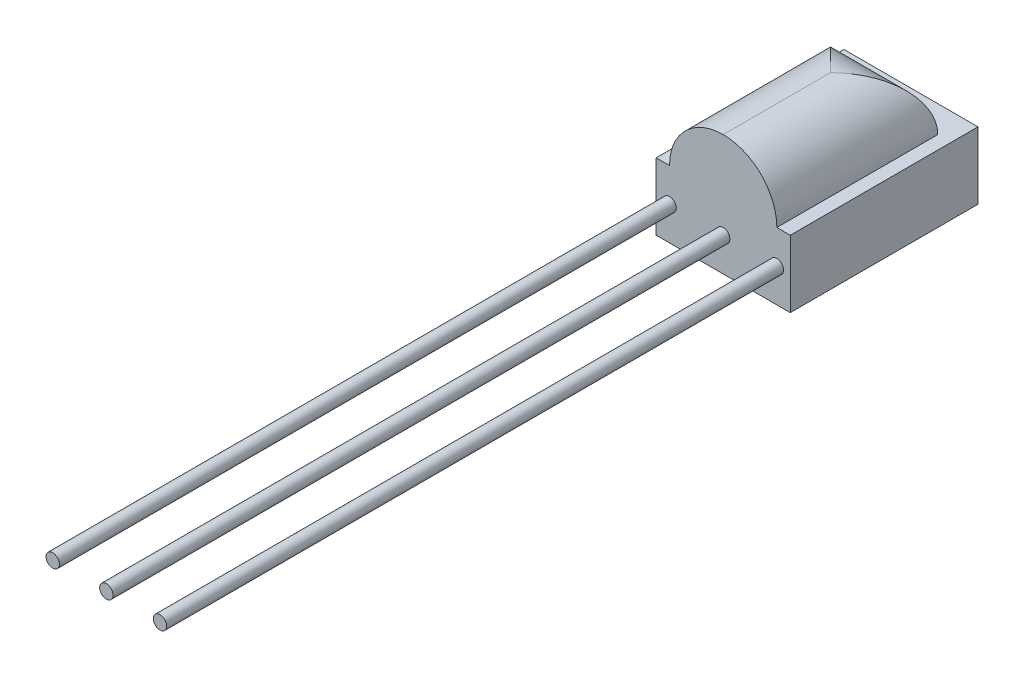
ISO-10303-21;
HEADER;
FILE_DESCRIPTION(('STEP AP214'),'2;1');
FILE_NAME('part.step','',(''),(''),'','','');
FILE_SCHEMA(('AUTOMOTIVE_DESIGN { 1 0 10303 214 1 1 1 1 }'));
ENDSEC;
DATA;
#1=APPLICATION_CONTEXT('core data for automotive mechanical design processes');
#2=APPLICATION_PROTOCOL_DEFINITION('international standard','automotive_design',2000,#1);
#3=PRODUCT_CONTEXT('',#1,'mechanical');
#4=PRODUCT('Part','Part','',(#3));
#5=PRODUCT_RELATED_PRODUCT_CATEGORY('part','',(#4));
#6=PRODUCT_DEFINITION_FORMATION('','',#4);
#7=PRODUCT_DEFINITION_CONTEXT('part definition',#1,'design');
#8=PRODUCT_DEFINITION('design','',#6,#7);
#9=PRODUCT_DEFINITION_SHAPE('','',#8);
#10=(LENGTH_UNIT() NAMED_UNIT(*) SI_UNIT(.MILLI.,.METRE.));
#11=(NAMED_UNIT(*) PLANE_ANGLE_UNIT() SI_UNIT($,.RADIAN.));
#12=(NAMED_UNIT(*) SI_UNIT($,.STERADIAN.) SOLID_ANGLE_UNIT());
#13=UNCERTAINTY_MEASURE_WITH_UNIT(LENGTH_MEASURE(1.E-05),#10,'distance_accuracy_value','');
#14=(GEOMETRIC_REPRESENTATION_CONTEXT(3) GLOBAL_UNCERTAINTY_ASSIGNED_CONTEXT((#13)) GLOBAL_UNIT_ASSIGNED_CONTEXT((#10,
#11,#12)) REPRESENTATION_CONTEXT('',''));
#15=CARTESIAN_POINT('',(0.,0.,0.));
#16=DIRECTION('',(0.,0.,1.));
#17=DIRECTION('',(1.,0.,0.));
#18=AXIS2_PLACEMENT_3D('',#15,#16,#17);
#19=CARTESIAN_POINT('',(0.,2.5,0.));
#20=DIRECTION('',(0.,-1.,0.));
#21=DIRECTION('',(0.,0.,-1.));
#22=AXIS2_PLACEMENT_3D('',#19,#20,#21);
#23=PLANE('',#22);
#24=DIRECTION('',(0.,0.,1.));
#25=VECTOR('',#24,1.);
#26=CARTESIAN_POINT('',(0.5,2.5,-6.));
#27=LINE('',#26,#25);
#28=CARTESIAN_POINT('',(0.5,2.5,-6.));
#29=VERTEX_POINT('',#28);
#30=CARTESIAN_POINT('',(0.500000000000001,2.5,0.));
#31=VERTEX_POINT('',#30);
#32=EDGE_CURVE('E99',#29,#31,#27,.T.);
#33=ORIENTED_EDGE('',*,*,#32,.F.);
#34=DIRECTION('',(-1.,0.,0.));
#35=VECTOR('',#34,1.);
#36=CARTESIAN_POINT('',(0.5,2.5,-6.));
#37=LINE('',#36,#35);
#38=CARTESIAN_POINT('',(4.5,2.5,-6.));
#39=VERTEX_POINT('',#38);
#40=EDGE_CURVE('E87',#39,#29,#37,.T.);
#41=ORIENTED_EDGE('',*,*,#40,.F.);
#42=DIRECTION('',(0.,0.,-1.));
#43=VECTOR('',#42,1.);
#44=CARTESIAN_POINT('',(4.5,2.5,-6.));
#45=LINE('',#44,#43);
#46=CARTESIAN_POINT('',(4.5,2.5,0.));
#47=VERTEX_POINT('',#46);
#48=EDGE_CURVE('E104',#47,#39,#45,.T.);
#49=ORIENTED_EDGE('',*,*,#48,.F.);
#50=DIRECTION('',(1.,0.,0.));
#51=VECTOR('',#50,1.);
#52=CARTESIAN_POINT('',(0.,2.5,0.));
#53=LINE('',#52,#51);
#54=CARTESIAN_POINT('',(5.,2.5,0.));
#55=VERTEX_POINT('',#54);
#56=EDGE_CURVE('E133',#47,#55,#53,.T.);
#57=ORIENTED_EDGE('',*,*,#56,.T.);
#58=DIRECTION('',(0.,0.,-1.));
#59=VECTOR('',#58,1.);
#60=CARTESIAN_POINT('',(5.,2.5,0.));
#61=LINE('',#60,#59);
#62=CARTESIAN_POINT('',(5.,2.5,-7.));
#63=VERTEX_POINT('',#62);
#64=EDGE_CURVE('E137',#55,#63,#61,.T.);
#65=ORIENTED_EDGE('',*,*,#64,.T.);
#66=DIRECTION('',(-1.,0.,0.));
#67=VECTOR('',#66,1.);
#68=CARTESIAN_POINT('',(0.,2.5,-7.));
#69=LINE('',#68,#67);
#70=CARTESIAN_POINT('',(0.,2.5,-7.));
#71=VERTEX_POINT('',#70);
#72=EDGE_CURVE('E165',#63,#71,#69,.T.);
#73=ORIENTED_EDGE('',*,*,#72,.T.);
#74=DIRECTION('',(0.,0.,1.));
#75=VECTOR('',#74,1.);
#76=CARTESIAN_POINT('',(0.,2.5,0.));
#77=LINE('',#76,#75);
#78=CARTESIAN_POINT('',(0.,2.5,0.));
#79=VERTEX_POINT('',#78);
#80=EDGE_CURVE('E130',#71,#79,#77,.T.);
#81=ORIENTED_EDGE('',*,*,#80,.T.);
#82=EDGE_CURVE('E142',#79,#31,#53,.T.);
#83=ORIENTED_EDGE('',*,*,#82,.T.);
#84=EDGE_LOOP('',(#33,#41,#49,#57,#65,#73,#81,#83));
#85=FACE_BOUND('',#84,.T.);
#86=ADVANCED_FACE('F33',(#85),#23,.F.);
#87=CARTESIAN_POINT('',(0.,2.5,0.));
#88=DIRECTION('',(0.,0.,-1.));
#89=DIRECTION('',(-1.,0.,0.));
#90=AXIS2_PLACEMENT_3D('',#87,#88,#89);
#91=PLANE('',#90);
#92=CARTESIAN_POINT('',(2.5,1.25,0.));
#93=DIRECTION('',(0.,0.,-1.));
#94=DIRECTION('',(-1.,0.,0.));
#95=AXIS2_PLACEMENT_3D('',#92,#93,#94);
#96=CIRCLE('',#95,0.25);
#97=CARTESIAN_POINT('',(2.25,1.25,0.));
#98=VERTEX_POINT('',#97);
#99=EDGE_CURVE('E147',#98,#98,#96,.F.);
#100=ORIENTED_EDGE('',*,*,#99,.F.);
#101=EDGE_LOOP('',(#100));
#102=FACE_BOUND('',#101,.T.);
#103=ORIENTED_EDGE('',*,*,#56,.F.);
#104=CARTESIAN_POINT('',(2.5,2.5,0.));
#105=DIRECTION('',(0.,0.,-1.));
#106=DIRECTION('',(-1.,0.,0.));
#107=AXIS2_PLACEMENT_3D('',#104,#105,#106);
#108=CIRCLE('',#107,2.);
#109=CARTESIAN_POINT('',(2.5,4.5,0.));
#110=VERTEX_POINT('',#109);
#111=EDGE_CURVE('E11',#47,#110,#108,.F.);
#112=ORIENTED_EDGE('',*,*,#111,.T.);
#113=CARTESIAN_POINT('',(2.5,2.5,0.));
#114=DIRECTION('',(0.,0.,-1.));
#115=DIRECTION('',(-1.,0.,0.));
#116=AXIS2_PLACEMENT_3D('',#113,#114,#115);
#117=CIRCLE('',#116,2.);
#118=EDGE_CURVE('E43',#110,#31,#117,.F.);
#119=ORIENTED_EDGE('',*,*,#118,.T.);
#120=ORIENTED_EDGE('',*,*,#82,.F.);
#121=DIRECTION('',(0.,-1.,0.));
#122=VECTOR('',#121,1.);
#123=CARTESIAN_POINT('',(0.,2.5,0.));
#124=LINE('',#123,#122);
#125=CARTESIAN_POINT('',(0.,0.,0.));
#126=VERTEX_POINT('',#125);
#127=EDGE_CURVE('E153',#79,#126,#124,.T.);
#128=ORIENTED_EDGE('',*,*,#127,.T.);
#129=DIRECTION('',(1.,0.,0.));
#130=VECTOR('',#129,1.);
#131=CARTESIAN_POINT('',(0.,0.,0.));
#132=LINE('',#131,#130);
#133=CARTESIAN_POINT('',(5.,0.,0.));
#134=VERTEX_POINT('',#133);
#135=EDGE_CURVE('E169',#126,#134,#132,.T.);
#136=ORIENTED_EDGE('',*,*,#135,.T.);
#137=DIRECTION('',(0.,-1.,0.));
#138=VECTOR('',#137,1.);
#139=CARTESIAN_POINT('',(5.,2.5,0.));
#140=LINE('',#139,#138);
#141=EDGE_CURVE('E156',#55,#134,#140,.T.);
#142=ORIENTED_EDGE('',*,*,#141,.F.);
#143=EDGE_LOOP('',(#103,#112,#119,#120,#128,#136,#142));
#144=FACE_BOUND('',#143,.T.);
#145=CARTESIAN_POINT('',(0.5,1.25,0.));
#146=DIRECTION('',(0.,0.,-1.));
#147=DIRECTION('',(-1.,0.,0.));
#148=AXIS2_PLACEMENT_3D('',#145,#146,#147);
#149=CIRCLE('',#148,0.25);
#150=CARTESIAN_POINT('',(0.25,1.25,0.));
#151=VERTEX_POINT('',#150);
#152=EDGE_CURVE('E150',#151,#151,#149,.F.);
#153=ORIENTED_EDGE('',*,*,#152,.F.);
#154=EDGE_LOOP('',(#153));
#155=FACE_BOUND('',#154,.T.);
#156=CARTESIAN_POINT('',(4.5,1.25,0.));
#157=DIRECTION('',(0.,0.,-1.));
#158=DIRECTION('',(-1.,0.,0.));
#159=AXIS2_PLACEMENT_3D('',#156,#157,#158);
#160=CIRCLE('',#159,0.25);
#161=CARTESIAN_POINT('',(4.25,1.25,0.));
#162=VERTEX_POINT('',#161);
#163=EDGE_CURVE('E112',#162,#162,#160,.F.);
#164=ORIENTED_EDGE('',*,*,#163,.F.);
#165=EDGE_LOOP('',(#164));
#166=FACE_BOUND('',#165,.T.);
#167=ADVANCED_FACE('F188',(#102,#144,#155,#166),#91,.F.);
#168=CARTESIAN_POINT('',(0.,2.5,0.));
#169=DIRECTION('',(1.,0.,0.));
#170=DIRECTION('',(0.,0.,-1.));
#171=AXIS2_PLACEMENT_3D('',#168,#169,#170);
#172=PLANE('',#171);
#173=DIRECTION('',(0.,0.,1.));
#174=VECTOR('',#173,1.);
#175=CARTESIAN_POINT('',(0.,0.,0.));
#176=LINE('',#175,#174);
#177=CARTESIAN_POINT('',(0.,0.,-7.));
#178=VERTEX_POINT('',#177);
#179=EDGE_CURVE('E129',#178,#126,#176,.T.);
#180=ORIENTED_EDGE('',*,*,#179,.T.);
#181=ORIENTED_EDGE('',*,*,#127,.F.);
#182=ORIENTED_EDGE('',*,*,#80,.F.);
#183=DIRECTION('',(0.,-1.,0.));
#184=VECTOR('',#183,1.);
#185=CARTESIAN_POINT('',(0.,2.5,-7.));
#186=LINE('',#185,#184);
#187=EDGE_CURVE('E162',#71,#178,#186,.T.);
#188=ORIENTED_EDGE('',*,*,#187,.T.);
#189=EDGE_LOOP('',(#180,#181,#182,#188));
#190=FACE_BOUND('',#189,.T.);
#191=ADVANCED_FACE('F187',(#190),#172,.F.);
#192=CARTESIAN_POINT('',(5.,2.5,0.));
#193=DIRECTION('',(-1.,0.,0.));
#194=DIRECTION('',(0.,0.,1.));
#195=AXIS2_PLACEMENT_3D('',#192,#193,#194);
#196=PLANE('',#195);
#197=DIRECTION('',(0.,0.,-1.));
#198=VECTOR('',#197,1.);
#199=CARTESIAN_POINT('',(5.,0.,0.));
#200=LINE('',#199,#198);
#201=CARTESIAN_POINT('',(5.,0.,-7.));
#202=VERTEX_POINT('',#201);
#203=EDGE_CURVE('E167',#134,#202,#200,.T.);
#204=ORIENTED_EDGE('',*,*,#203,.T.);
#205=DIRECTION('',(0.,-1.,0.));
#206=VECTOR('',#205,1.);
#207=CARTESIAN_POINT('',(5.,2.5,-7.));
#208=LINE('',#207,#206);
#209=EDGE_CURVE('E159',#63,#202,#208,.T.);
#210=ORIENTED_EDGE('',*,*,#209,.F.);
#211=ORIENTED_EDGE('',*,*,#64,.F.);
#212=ORIENTED_EDGE('',*,*,#141,.T.);
#213=EDGE_LOOP('',(#204,#210,#211,#212));
#214=FACE_BOUND('',#213,.T.);
#215=ADVANCED_FACE('F178',(#214),#196,.F.);
#216=CARTESIAN_POINT('',(0.,2.5,-7.));
#217=DIRECTION('',(0.,0.,1.));
#218=DIRECTION('',(1.,0.,0.));
#219=AXIS2_PLACEMENT_3D('',#216,#217,#218);
#220=PLANE('',#219);
#221=DIRECTION('',(-1.,0.,0.));
#222=VECTOR('',#221,1.);
#223=CARTESIAN_POINT('',(0.,0.,-7.));
#224=LINE('',#223,#222);
#225=EDGE_CURVE('E134',#202,#178,#224,.T.);
#226=ORIENTED_EDGE('',*,*,#225,.T.);
#227=ORIENTED_EDGE('',*,*,#187,.F.);
#228=ORIENTED_EDGE('',*,*,#72,.F.);
#229=ORIENTED_EDGE('',*,*,#209,.T.);
#230=EDGE_LOOP('',(#226,#227,#228,#229));
#231=FACE_BOUND('',#230,.T.);
#232=ADVANCED_FACE('F182',(#231),#220,.F.);
#233=CARTESIAN_POINT('',(0.,0.,0.));
#234=DIRECTION('',(0.,-1.,0.));
#235=DIRECTION('',(0.,0.,-1.));
#236=AXIS2_PLACEMENT_3D('',#233,#234,#235);
#237=PLANE('',#236);
#238=ORIENTED_EDGE('',*,*,#179,.F.);
#239=ORIENTED_EDGE('',*,*,#225,.F.);
#240=ORIENTED_EDGE('',*,*,#203,.F.);
#241=ORIENTED_EDGE('',*,*,#135,.F.);
#242=EDGE_LOOP('',(#238,#239,#240,#241));
#243=FACE_BOUND('',#242,.T.);
#244=ADVANCED_FACE('F191',(#243),#237,.T.);
#245=CARTESIAN_POINT('',(0.5,1.25,23.));
#246=DIRECTION('',(0.,0.,-1.));
#247=DIRECTION('',(-1.,0.,0.));
#248=AXIS2_PLACEMENT_3D('',#245,#246,#247);
#249=CYLINDRICAL_SURFACE('',#248,0.25);
#250=CARTESIAN_POINT('',(0.5,1.25,23.));
#251=DIRECTION('',(0.,0.,1.));
#252=DIRECTION('',(1.,0.,0.));
#253=AXIS2_PLACEMENT_3D('',#250,#251,#252);
#254=CIRCLE('',#253,0.25);
#255=CARTESIAN_POINT('',(0.75,1.25,23.));
#256=VERTEX_POINT('',#255);
#257=EDGE_CURVE('E126',#256,#256,#254,.T.);
#258=ORIENTED_EDGE('',*,*,#257,.F.);
#259=EDGE_LOOP('',(#258));
#260=FACE_BOUND('',#259,.T.);
#261=ORIENTED_EDGE('',*,*,#152,.T.);
#262=EDGE_LOOP('',(#261));
#263=FACE_BOUND('',#262,.T.);
#264=ADVANCED_FACE('F193',(#260,#263),#249,.T.);
#265=CARTESIAN_POINT('',(0.5,1.25,23.));
#266=DIRECTION('',(0.,0.,1.));
#267=DIRECTION('',(1.,0.,0.));
#268=AXIS2_PLACEMENT_3D('',#265,#266,#267);
#269=PLANE('',#268);
#270=ORIENTED_EDGE('',*,*,#257,.T.);
#271=EDGE_LOOP('',(#270));
#272=FACE_BOUND('',#271,.T.);
#273=ADVANCED_FACE('F199',(#272),#269,.T.);
#274=CARTESIAN_POINT('',(2.5,1.25,23.));
#275=DIRECTION('',(0.,0.,-1.));
#276=DIRECTION('',(-1.,0.,0.));
#277=AXIS2_PLACEMENT_3D('',#274,#275,#276);
#278=CYLINDRICAL_SURFACE('',#277,0.25);
#279=CARTESIAN_POINT('',(2.5,1.25,23.));
#280=DIRECTION('',(0.,0.,1.));
#281=DIRECTION('',(1.,0.,0.));
#282=AXIS2_PLACEMENT_3D('',#279,#280,#281);
#283=CIRCLE('',#282,0.25);
#284=CARTESIAN_POINT('',(2.75,1.25,23.));
#285=VERTEX_POINT('',#284);
#286=EDGE_CURVE('E123',#285,#285,#283,.T.);
#287=ORIENTED_EDGE('',*,*,#286,.F.);
#288=EDGE_LOOP('',(#287));
#289=FACE_BOUND('',#288,.T.);
#290=ORIENTED_EDGE('',*,*,#99,.T.);
#291=EDGE_LOOP('',(#290));
#292=FACE_BOUND('',#291,.T.);
#293=ADVANCED_FACE('F213',(#289,#292),#278,.T.);
#294=CARTESIAN_POINT('',(2.5,1.25,23.));
#295=DIRECTION('',(0.,0.,1.));
#296=DIRECTION('',(1.,0.,0.));
#297=AXIS2_PLACEMENT_3D('',#294,#295,#296);
#298=PLANE('',#297);
#299=ORIENTED_EDGE('',*,*,#286,.T.);
#300=EDGE_LOOP('',(#299));
#301=FACE_BOUND('',#300,.T.);
#302=ADVANCED_FACE('F217',(#301),#298,.T.);
#303=CARTESIAN_POINT('',(4.5,1.25,23.));
#304=DIRECTION('',(0.,0.,-1.));
#305=DIRECTION('',(-1.,0.,0.));
#306=AXIS2_PLACEMENT_3D('',#303,#304,#305);
#307=CYLINDRICAL_SURFACE('',#306,0.25);
#308=CARTESIAN_POINT('',(4.5,1.25,23.));
#309=DIRECTION('',(0.,0.,1.));
#310=DIRECTION('',(1.,0.,0.));
#311=AXIS2_PLACEMENT_3D('',#308,#309,#310);
#312=CIRCLE('',#311,0.25);
#313=CARTESIAN_POINT('',(4.75,1.25,23.));
#314=VERTEX_POINT('',#313);
#315=EDGE_CURVE('E120',#314,#314,#312,.T.);
#316=ORIENTED_EDGE('',*,*,#315,.F.);
#317=EDGE_LOOP('',(#316));
#318=FACE_BOUND('',#317,.T.);
#319=ORIENTED_EDGE('',*,*,#163,.T.);
#320=EDGE_LOOP('',(#319));
#321=FACE_BOUND('',#320,.T.);
#322=ADVANCED_FACE('F221',(#318,#321),#307,.T.);
#323=CARTESIAN_POINT('',(4.5,1.25,23.));
#324=DIRECTION('',(0.,0.,1.));
#325=DIRECTION('',(1.,0.,0.));
#326=AXIS2_PLACEMENT_3D('',#323,#324,#325);
#327=PLANE('',#326);
#328=ORIENTED_EDGE('',*,*,#315,.T.);
#329=EDGE_LOOP('',(#328));
#330=FACE_BOUND('',#329,.T.);
#331=ADVANCED_FACE('F225',(#330),#327,.T.);
#332=CARTESIAN_POINT('',(2.5,2.5,0.));
#333=DIRECTION('',(0.,0.,-1.));
#334=DIRECTION('',(-1.,0.,0.));
#335=AXIS2_PLACEMENT_3D('',#332,#333,#334);
#336=CYLINDRICAL_SURFACE('',#335,2.);
#337=CARTESIAN_POINT('',(2.5,2.5,-4.));
#338=DIRECTION('',(0.707106781186547,0.,-0.707106781186547));
#339=DIRECTION('',(-0.707106781186547,0.,-0.707106781186548));
#340=AXIS2_PLACEMENT_3D('',#337,#338,#339);
#341=ELLIPSE('',#340,2.82842712474619,2.);
#342=CARTESIAN_POINT('',(2.5,4.5,-4.));
#343=VERTEX_POINT('',#342);
#344=EDGE_CURVE('E37',#29,#343,#341,.T.);
#345=ORIENTED_EDGE('',*,*,#344,.F.);
#346=ORIENTED_EDGE('',*,*,#32,.T.);
#347=ORIENTED_EDGE('',*,*,#118,.F.);
#348=DIRECTION('',(0.,0.,1.));
#349=VECTOR('',#348,1.);
#350=CARTESIAN_POINT('',(2.5,4.5,0.));
#351=LINE('',#350,#349);
#352=EDGE_CURVE('E100',#343,#110,#351,.T.);
#353=ORIENTED_EDGE('',*,*,#352,.F.);
#354=EDGE_LOOP('',(#345,#346,#347,#353));
#355=FACE_BOUND('',#354,.T.);
#356=ADVANCED_FACE('F35',(#355),#336,.T.);
#357=CARTESIAN_POINT('',(0.,2.5,-4.));
#358=DIRECTION('',(1.,0.,0.));
#359=DIRECTION('',(0.,0.,-1.));
#360=AXIS2_PLACEMENT_3D('',#357,#358,#359);
#361=CYLINDRICAL_SURFACE('',#360,2.);
#362=ORIENTED_EDGE('',*,*,#40,.T.);
#363=ORIENTED_EDGE('',*,*,#344,.T.);
#364=CARTESIAN_POINT('',(2.5,2.5,-4.));
#365=DIRECTION('',(0.707106781186547,0.,0.707106781186547));
#366=DIRECTION('',(0.707106781186547,0.,-0.707106781186547));
#367=AXIS2_PLACEMENT_3D('',#364,#365,#366);
#368=ELLIPSE('',#367,2.82842712474619,2.);
#369=EDGE_CURVE('E96',#39,#343,#368,.T.);
#370=ORIENTED_EDGE('',*,*,#369,.F.);
#371=EDGE_LOOP('',(#362,#363,#370));
#372=FACE_BOUND('',#371,.T.);
#373=ADVANCED_FACE('F94',(#372),#361,.T.);
#374=CARTESIAN_POINT('',(2.5,2.5,0.));
#375=DIRECTION('',(0.,0.,1.));
#376=DIRECTION('',(1.,0.,0.));
#377=AXIS2_PLACEMENT_3D('',#374,#375,#376);
#378=CYLINDRICAL_SURFACE('',#377,2.);
#379=ORIENTED_EDGE('',*,*,#111,.F.);
#380=ORIENTED_EDGE('',*,*,#48,.T.);
#381=ORIENTED_EDGE('',*,*,#369,.T.);
#382=ORIENTED_EDGE('',*,*,#352,.T.);
#383=EDGE_LOOP('',(#379,#380,#381,#382));
#384=FACE_BOUND('',#383,.T.);
#385=ADVANCED_FACE('F103',(#384),#378,.T.);
#386=CLOSED_SHELL('',(#86,#167,#191,#215,#232,#244,#264,#273,#293,#302,#322,#331,#356,#373,#385));
#387=MANIFOLD_SOLID_BREP('B2',#386);
#388=ADVANCED_BREP_SHAPE_REPRESENTATION('',(#18,#387),#14);
#389=SHAPE_DEFINITION_REPRESENTATION(#9,#388);
ENDSEC;
END-ISO-10303-21;
